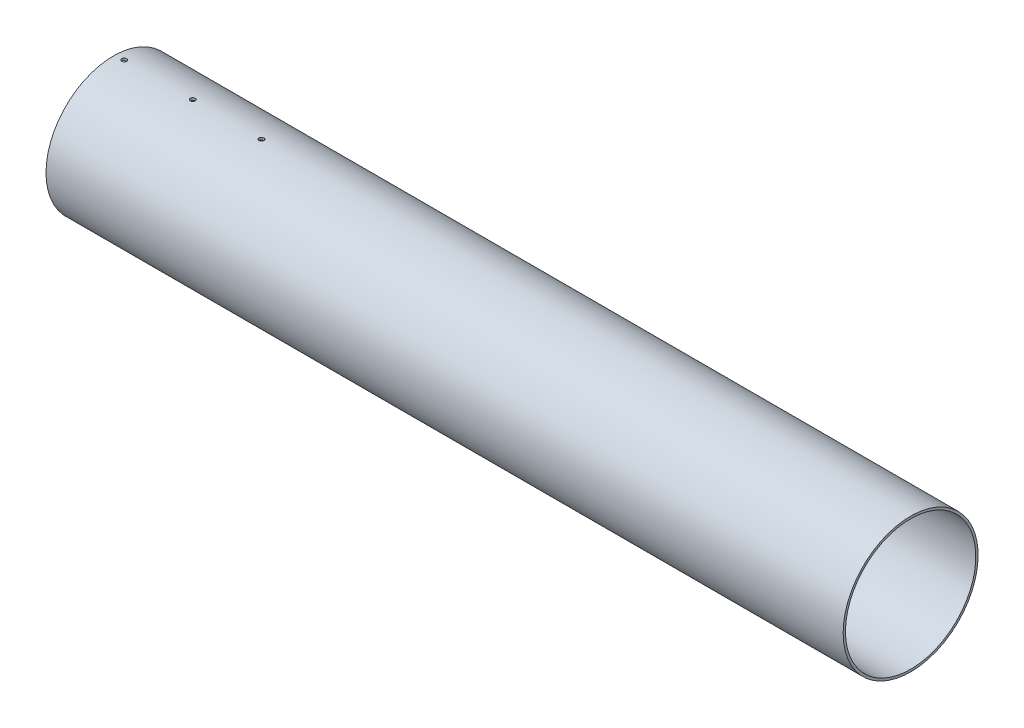
ISO-10303-21;
HEADER;
FILE_DESCRIPTION(('STEP AP214'),'2;1');
FILE_NAME('part.step','',(''),(''),'','','');
FILE_SCHEMA(('AUTOMOTIVE_DESIGN { 1 0 10303 214 1 1 1 1 }'));
ENDSEC;
DATA;
#1=APPLICATION_CONTEXT('core data for automotive mechanical design processes');
#2=APPLICATION_PROTOCOL_DEFINITION('international standard','automotive_design',2000,#1);
#3=PRODUCT_CONTEXT('',#1,'mechanical');
#4=PRODUCT('Part','Part','',(#3));
#5=PRODUCT_RELATED_PRODUCT_CATEGORY('part','',(#4));
#6=PRODUCT_DEFINITION_FORMATION('','',#4);
#7=PRODUCT_DEFINITION_CONTEXT('part definition',#1,'design');
#8=PRODUCT_DEFINITION('design','',#6,#7);
#9=PRODUCT_DEFINITION_SHAPE('','',#8);
#10=(LENGTH_UNIT() NAMED_UNIT(*) SI_UNIT(.MILLI.,.METRE.));
#11=(NAMED_UNIT(*) PLANE_ANGLE_UNIT() SI_UNIT($,.RADIAN.));
#12=(NAMED_UNIT(*) SI_UNIT($,.STERADIAN.) SOLID_ANGLE_UNIT());
#13=UNCERTAINTY_MEASURE_WITH_UNIT(LENGTH_MEASURE(1.E-05),#10,'distance_accuracy_value','');
#14=(GEOMETRIC_REPRESENTATION_CONTEXT(3) GLOBAL_UNCERTAINTY_ASSIGNED_CONTEXT((#13)) GLOBAL_UNIT_ASSIGNED_CONTEXT((#10,
#11,#12)) REPRESENTATION_CONTEXT('',''));
#15=CARTESIAN_POINT('',(0.,0.,0.));
#16=DIRECTION('',(0.,0.,1.));
#17=DIRECTION('',(1.,0.,0.));
#18=AXIS2_PLACEMENT_3D('',#15,#16,#17);
#19=CARTESIAN_POINT('',(0.,76.2,0.));
#20=DIRECTION('',(1.,0.,0.));
#21=DIRECTION('',(0.,0.,-1.));
#22=AXIS2_PLACEMENT_3D('',#19,#20,#21);
#23=PLANE('',#22);
#24=CARTESIAN_POINT('',(0.,0.,0.));
#25=DIRECTION('',(-1.,0.,0.));
#26=DIRECTION('',(0.,0.,1.));
#27=AXIS2_PLACEMENT_3D('',#24,#25,#26);
#28=CIRCLE('',#27,73.6092);
#29=CARTESIAN_POINT('',(0.,0.,73.6092));
#30=VERTEX_POINT('',#29);
#31=EDGE_CURVE('E45',#30,#30,#28,.T.);
#32=ORIENTED_EDGE('',*,*,#31,.F.);
#33=EDGE_LOOP('',(#32));
#34=FACE_BOUND('',#33,.T.);
#35=CARTESIAN_POINT('',(0.,0.,0.));
#36=DIRECTION('',(-1.,0.,0.));
#37=DIRECTION('',(0.,0.,1.));
#38=AXIS2_PLACEMENT_3D('',#35,#36,#37);
#39=CIRCLE('',#38,76.2);
#40=CARTESIAN_POINT('',(0.,0.,76.2));
#41=VERTEX_POINT('',#40);
#42=EDGE_CURVE('E77',#41,#41,#39,.T.);
#43=ORIENTED_EDGE('',*,*,#42,.T.);
#44=EDGE_LOOP('',(#43));
#45=FACE_BOUND('',#44,.T.);
#46=ADVANCED_FACE('F31',(#34,#45),#23,.F.);
#47=CARTESIAN_POINT('',(0.,0.,0.));
#48=DIRECTION('',(-1.,0.,0.));
#49=DIRECTION('',(0.,0.,1.));
#50=AXIS2_PLACEMENT_3D('',#47,#48,#49);
#51=CYLINDRICAL_SURFACE('',#50,73.6092);
#52=CARTESIAN_POINT('',(165.,73.6059837825038,0.688095959722686));
#53=CARTESIAN_POINT('',(165.15446929266,73.6059842831227,0.688089143597662));
#54=CARTESIAN_POINT('',(165.309049154193,73.6061094478616,0.67503746338891));
#55=CARTESIAN_POINT('',(165.613949849721,73.6065666337611,0.62315343551505));
#56=CARTESIAN_POINT('',(165.764265397929,73.6068989008431,0.584290434886237));
#57=CARTESIAN_POINT('',(166.056178474909,73.6076403171617,0.481890320900383));
#58=CARTESIAN_POINT('',(166.197780094308,73.6080494299529,0.418364888918095));
#59=CARTESIAN_POINT('',(166.468269830032,73.6087484289479,0.26845877703024));
#60=CARTESIAN_POINT('',(166.597161047605,73.6090383442899,0.18208369131227));
#61=CARTESIAN_POINT('',(166.838630024376,73.6092623489892,-0.0110879684674847));
#62=CARTESIAN_POINT('',(166.951205996039,73.6091963993874,-0.117886777229757));
#63=CARTESIAN_POINT('',(167.156833284504,73.6084636665608,-0.348871499237712));
#64=CARTESIAN_POINT('',(167.24988388687,73.6077968613553,-0.473058048425747));
#65=CARTESIAN_POINT('',(167.41379211394,73.6056443874573,-0.735252448345545));
#66=CARTESIAN_POINT('',(167.484655309991,73.604158924592,-0.873256817861151));
#67=CARTESIAN_POINT('',(167.602210457618,73.6002107900855,-1.15918886886157));
#68=CARTESIAN_POINT('',(167.648902525806,73.597748123159,-1.30711650246821));
#69=CARTESIAN_POINT('',(167.716788018404,73.5917746206579,-1.60864978023832));
#70=CARTESIAN_POINT('',(167.737988090478,73.5882640586459,-1.7622539333355));
#71=CARTESIAN_POINT('',(167.754322051861,73.5802274120274,-2.07081491635571));
#72=CARTESIAN_POINT('',(167.749455935889,73.5757013272152,-2.22577174655275));
#73=CARTESIAN_POINT('',(167.713802047991,73.5657752810624,-2.53271121606239));
#74=CARTESIAN_POINT('',(167.683003330484,73.5603749514999,-2.68469257177156));
#75=CARTESIAN_POINT('',(167.596355027046,73.5489506238271,-2.98131372327432));
#76=CARTESIAN_POINT('',(167.540505221373,73.5429266202464,-3.1259534546565));
#77=CARTESIAN_POINT('',(167.405266468792,73.5305840153582,-3.40395986420433));
#78=CARTESIAN_POINT('',(167.325851524547,73.5242650952176,-3.5373138819164));
#79=CARTESIAN_POINT('',(167.145753834864,73.5117352336343,-3.78879735569409));
#80=CARTESIAN_POINT('',(167.04507098776,73.5055242927078,-3.90692673897761));
#81=CARTESIAN_POINT('',(166.825219612942,73.4936276549916,-4.12467492278268));
#82=CARTESIAN_POINT('',(166.706040771465,73.4879422540937,-4.22428332707366));
#83=CARTESIAN_POINT('',(166.452610612723,73.4775071278569,-4.40207085909387));
#84=CARTESIAN_POINT('',(166.318359378464,73.4727573973655,-4.48025010482835));
#85=CARTESIAN_POINT('',(166.038739261076,73.4645503950928,-4.61287241836467));
#86=CARTESIAN_POINT('',(165.893382139721,73.4610917781911,-4.66734019936069));
#87=CARTESIAN_POINT('',(165.595558410428,73.4557228247752,-4.75109308399522));
#88=CARTESIAN_POINT('',(165.443091889933,73.4538124692233,-4.78037849728264));
#89=CARTESIAN_POINT('',(165.135682912205,73.451689328727,-4.81289206243856));
#90=CARTESIAN_POINT('',(164.980745620328,73.4514733747885,-4.81616885766713));
#91=CARTESIAN_POINT('',(164.672522704976,73.4527473620883,-4.79669899171546));
#92=CARTESIAN_POINT('',(164.519237072354,73.4542372938741,-4.77395247473265));
#93=CARTESIAN_POINT('',(164.218779258172,73.4588066165611,-4.70311603563841));
#94=CARTESIAN_POINT('',(164.071602812546,73.461884877983,-4.65504412219574));
#95=CARTESIAN_POINT('',(163.78741049707,73.4693964223735,-4.53494358324473));
#96=CARTESIAN_POINT('',(163.650394695652,73.4738297144674,-4.46291479640258));
#97=CARTESIAN_POINT('',(163.390224243495,73.4837283681259,-4.29684666762267));
#98=CARTESIAN_POINT('',(163.26708708459,73.4891950093501,-4.20277999987749));
#99=CARTESIAN_POINT('',(163.038339491366,73.5007635133932,-3.99535344990872));
#100=CARTESIAN_POINT('',(162.932729258677,73.5068653835183,-3.88199334576617));
#101=CARTESIAN_POINT('',(162.741834951625,73.5192973854577,-3.63896137665244));
#102=CARTESIAN_POINT('',(162.656588105437,73.5256279113493,-3.50926028825842));
#103=CARTESIAN_POINT('',(162.509080423696,73.5381003426952,-3.23737817754527));
#104=CARTESIAN_POINT('',(162.44681964998,73.5442422476419,-3.09519712165381));
#105=CARTESIAN_POINT('',(162.347026713028,73.5559849938833,-2.80229760393435));
#106=CARTESIAN_POINT('',(162.30950805696,73.5615855382181,-2.65157452753586));
#107=CARTESIAN_POINT('',(162.260331839056,73.5719665730914,-2.34593902118086));
#108=CARTESIAN_POINT('',(162.248674193611,73.576747066281,-2.19102660477008));
#109=CARTESIAN_POINT('',(162.251564361935,73.5853111259432,-1.88155577079569));
#110=CARTESIAN_POINT('',(162.266089002587,73.5890955705899,-1.72699716130362));
#111=CARTESIAN_POINT('',(162.320898305646,73.5956115305121,-1.4224939283462));
#112=CARTESIAN_POINT('',(162.361182873399,73.5983430496565,-1.27254928792908));
#113=CARTESIAN_POINT('',(162.466322933928,73.6027973111553,-0.981685619851943));
#114=CARTESIAN_POINT('',(162.531154705875,73.6045210233109,-0.84075803190006));
#115=CARTESIAN_POINT('',(162.683552514648,73.6071022558696,-0.57178226129702));
#116=CARTESIAN_POINT('',(162.771117654675,73.607959810435,-0.443733570867576));
#117=CARTESIAN_POINT('',(162.966471340188,73.6090144431281,-0.204178592926138));
#118=CARTESIAN_POINT('',(163.074254640249,73.6092116923167,-0.0926680281485954));
#119=CARTESIAN_POINT('',(163.307036199527,73.6091872018725,0.110712674729858));
#120=CARTESIAN_POINT('',(163.432038702315,73.608965358785,0.202577957079658));
#121=CARTESIAN_POINT('',(163.695777143936,73.6083440409598,0.364089228143964));
#122=CARTESIAN_POINT('',(163.834523885715,73.6079444256183,0.433717554162373));
#123=CARTESIAN_POINT('',(164.121629247267,73.6071781603076,0.548616752488847));
#124=CARTESIAN_POINT('',(164.269976258736,73.6068114717603,0.593916447543426));
#125=CARTESIAN_POINT('',(164.516042928568,73.6063597658129,0.64692766372909));
#126=CARTESIAN_POINT('',(164.612170646302,73.6062207270973,0.662346332875566));
#127=CARTESIAN_POINT('',(164.805517630183,73.6060325778304,0.682932627078205));
#128=CARTESIAN_POINT('',(164.90273689639,73.6059834672842,0.688100251562592));
#129=CARTESIAN_POINT('',(165.,73.6059837825038,0.688095959722686));
#130=B_SPLINE_CURVE_WITH_KNOTS('',3,(#52,#53,#54,#55,#56,#57,#58,#59,#60,#61,#62,#63,#64,#65,
#66,#67,#68,#69,#70,#71,#72,#73,#74,#75,#76,#77,#78,#79,#80,#81,#82,#83,#84,#85,#86,#87,#88,#89,
#90,#91,#92,#93,#94,#95,#96,#97,#98,#99,#100,#101,#102,#103,#104,#105,#106,#107,#108,#109,#110,
#111,#112,#113,#114,#115,#116,#117,#118,#119,#120,#121,#122,#123,#124,#125,#126,#127,#128,#129),
.UNSPECIFIED.,.T.,.F.,(4,2,2,2,2,2,2,2,2,2,2,2,2,2,2,2,2,2,2,2,2,2,2,2,2,2,2,2,2,2,2,2,2,2,2,2,
2,2,4),(0.,0.463053029383297,0.926656956135038,1.3900415639969,1.85331282811971,
2.31663481098125,2.77997374389316,3.24319623704508,3.70641649538275,4.16951593142185,
4.63261546126814,5.09591055328104,5.55920970929014,6.02302189471975,6.48683629734375,
6.95091026832061,7.41498168370198,7.87856825741837,8.34214913067303,8.8048627737912,
9.26757385298542,9.72995634559745,10.1923419521152,10.655303955462,11.1182712842982,
11.582078637094,12.0458872376151,12.5099488304784,12.9740089230346,13.4376584922475,
13.9013063578044,14.3645073228543,14.8276900180431,15.2907527103202,15.753929726478,
16.2174737319162,16.6804673467342,16.9720332074059,17.2635990843404),.UNSPECIFIED.);
#131=CARTESIAN_POINT('',(165.,73.6059837825038,0.688095959722686));
#132=VERTEX_POINT('',#131);
#133=EDGE_CURVE('E90',#132,#132,#130,.T.);
#134=ORIENTED_EDGE('',*,*,#133,.T.);
#135=EDGE_LOOP('',(#134));
#136=FACE_BOUND('',#135,.T.);
#137=CARTESIAN_POINT('',(87.5,73.6059837825038,0.688095959722676));
#138=CARTESIAN_POINT('',(87.6544692926599,73.6059842831227,0.688089143597653));
#139=CARTESIAN_POINT('',(87.8090491541929,73.6061094478616,0.675037463388901));
#140=CARTESIAN_POINT('',(88.1139498497208,73.6065666337611,0.623153435515038));
#141=CARTESIAN_POINT('',(88.2642653979287,73.6068989008431,0.584290434886223));
#142=CARTESIAN_POINT('',(88.5561784749091,73.6076403171617,0.481890320900373));
#143=CARTESIAN_POINT('',(88.6977800943081,73.6080494299529,0.418364888918091));
#144=CARTESIAN_POINT('',(88.9682698300324,73.6087484289479,0.268458777030234));
#145=CARTESIAN_POINT('',(89.0971610476049,73.6090383442899,0.182083691312253));
#146=CARTESIAN_POINT('',(89.3386300243757,73.6092623489892,-0.0110879684675091));
#147=CARTESIAN_POINT('',(89.4512059960388,73.6091963993874,-0.117886777229776));
#148=CARTESIAN_POINT('',(89.6568332845037,73.6084636665608,-0.348871499237724));
#149=CARTESIAN_POINT('',(89.7498838868699,73.6077968613553,-0.473058048425758));
#150=CARTESIAN_POINT('',(89.9137921139398,73.6056443874573,-0.735252448345561));
#151=CARTESIAN_POINT('',(89.9846553099907,73.604158924592,-0.873256817861171));
#152=CARTESIAN_POINT('',(90.1022104576177,73.6002107900855,-1.1591888688616));
#153=CARTESIAN_POINT('',(90.1489025258062,73.597748123159,-1.30711650246824));
#154=CARTESIAN_POINT('',(90.2167880184037,73.5917746206579,-1.60864978023834));
#155=CARTESIAN_POINT('',(90.237988090478,73.5882640586459,-1.76225393333552));
#156=CARTESIAN_POINT('',(90.2543220518608,73.5802274120274,-2.07081491635573));
#157=CARTESIAN_POINT('',(90.2494559358891,73.5757013272152,-2.22577174655276));
#158=CARTESIAN_POINT('',(90.2138020479912,73.5657752810624,-2.5327112160624));
#159=CARTESIAN_POINT('',(90.1830033304842,73.5603749514999,-2.68469257177157));
#160=CARTESIAN_POINT('',(90.0963550270464,73.5489506238271,-2.98131372327433));
#161=CARTESIAN_POINT('',(90.0405052213733,73.5429266202464,-3.12595345465651));
#162=CARTESIAN_POINT('',(89.9052664687915,73.5305840153582,-3.40395986420434));
#163=CARTESIAN_POINT('',(89.8258515245468,73.5242650952176,-3.53731388191641));
#164=CARTESIAN_POINT('',(89.645753834864,73.5117352336343,-3.7887973556941));
#165=CARTESIAN_POINT('',(89.5450709877596,73.5055242927078,-3.90692673897761));
#166=CARTESIAN_POINT('',(89.3252196129419,73.4936276549916,-4.12467492278268));
#167=CARTESIAN_POINT('',(89.2060407714651,73.4879422540937,-4.22428332707366));
#168=CARTESIAN_POINT('',(88.9526106127231,73.4775071278569,-4.40207085909387));
#169=CARTESIAN_POINT('',(88.8183593784637,73.4727573973655,-4.48025010482835));
#170=CARTESIAN_POINT('',(88.5387392610756,73.4645503950928,-4.61287241836466));
#171=CARTESIAN_POINT('',(88.3933821397211,73.4610917781911,-4.66734019936067));
#172=CARTESIAN_POINT('',(88.0955584104282,73.4557228247752,-4.7510930839952));
#173=CARTESIAN_POINT('',(87.9430918899332,73.4538124692233,-4.78037849728262));
#174=CARTESIAN_POINT('',(87.6356829122052,73.451689328727,-4.81289206243855));
#175=CARTESIAN_POINT('',(87.4807456203282,73.4514733747885,-4.81616885766712));
#176=CARTESIAN_POINT('',(87.1725227049764,73.4527473620883,-4.79669899171544));
#177=CARTESIAN_POINT('',(87.0192370723542,73.4542372938741,-4.77395247473263));
#178=CARTESIAN_POINT('',(86.7187792581719,73.4588066165611,-4.70311603563839));
#179=CARTESIAN_POINT('',(86.5716028125465,73.461884877983,-4.65504412219572));
#180=CARTESIAN_POINT('',(86.2874104970703,73.4693964223735,-4.53494358324472));
#181=CARTESIAN_POINT('',(86.1503946956524,73.4738297144674,-4.46291479640256));
#182=CARTESIAN_POINT('',(85.8902242434955,73.4837283681259,-4.29684666762265));
#183=CARTESIAN_POINT('',(85.7670870845898,73.4891950093501,-4.20277999987747));
#184=CARTESIAN_POINT('',(85.5383394913665,73.5007635133932,-3.9953534499087));
#185=CARTESIAN_POINT('',(85.4327292586765,73.5068653835183,-3.88199334576614));
#186=CARTESIAN_POINT('',(85.2418349516253,73.5192973854577,-3.63896137665241));
#187=CARTESIAN_POINT('',(85.156588105437,73.5256279113493,-3.50926028825839));
#188=CARTESIAN_POINT('',(85.009080423696,73.5381003426952,-3.23737817754524));
#189=CARTESIAN_POINT('',(84.9468196499804,73.5442422476419,-3.09519712165378));
#190=CARTESIAN_POINT('',(84.8470267130279,73.5559849938833,-2.80229760393432));
#191=CARTESIAN_POINT('',(84.8095080569598,73.5615855382181,-2.65157452753583));
#192=CARTESIAN_POINT('',(84.7603318390556,73.5719665730914,-2.34593902118084));
#193=CARTESIAN_POINT('',(84.7486741936111,73.576747066281,-2.19102660477006));
#194=CARTESIAN_POINT('',(84.7515643619355,73.5853111259432,-1.88155577079568));
#195=CARTESIAN_POINT('',(84.7660890025868,73.5890955705899,-1.7269971613036));
#196=CARTESIAN_POINT('',(84.8208983056457,73.5956115305121,-1.42249392834618));
#197=CARTESIAN_POINT('',(84.8611828733993,73.5983430496565,-1.27254928792906));
#198=CARTESIAN_POINT('',(84.9663229339285,73.6027973111553,-0.981685619851929));
#199=CARTESIAN_POINT('',(85.0311547058751,73.6045210233109,-0.840758031900052));
#200=CARTESIAN_POINT('',(85.1835525146484,73.6071022558696,-0.571782261297015));
#201=CARTESIAN_POINT('',(85.2711176546754,73.607959810435,-0.443733570867567));
#202=CARTESIAN_POINT('',(85.466471340188,73.6090144431281,-0.204178592926119));
#203=CARTESIAN_POINT('',(85.5742546402488,73.6092116923167,-0.0926680281485712));
#204=CARTESIAN_POINT('',(85.8070361995274,73.6091872018725,0.110712674729876));
#205=CARTESIAN_POINT('',(85.9320387023147,73.608965358785,0.202577957079665));
#206=CARTESIAN_POINT('',(86.1957771439358,73.6083440409598,0.364089228143968));
#207=CARTESIAN_POINT('',(86.3345238857149,73.6079444256183,0.433717554162385));
#208=CARTESIAN_POINT('',(86.621629247267,73.6071781603076,0.548616752488854));
#209=CARTESIAN_POINT('',(86.7699762587363,73.6068114717603,0.593916447543425));
#210=CARTESIAN_POINT('',(87.016042928568,73.6063597658129,0.646927663729081));
#211=CARTESIAN_POINT('',(87.1121706463022,73.6062207270973,0.662346332875556));
#212=CARTESIAN_POINT('',(87.3055176301827,73.6060325778304,0.682932627078193));
#213=CARTESIAN_POINT('',(87.40273689639,73.6059834672842,0.688100251562581));
#214=CARTESIAN_POINT('',(87.5,73.6059837825038,0.688095959722676));
#215=B_SPLINE_CURVE_WITH_KNOTS('',3,(#137,#138,#139,#140,#141,#142,#143,#144,#145,#146,#147,
#148,#149,#150,#151,#152,#153,#154,#155,#156,#157,#158,#159,#160,#161,#162,#163,#164,#165,#166,
#167,#168,#169,#170,#171,#172,#173,#174,#175,#176,#177,#178,#179,#180,#181,#182,#183,#184,#185,
#186,#187,#188,#189,#190,#191,#192,#193,#194,#195,#196,#197,#198,#199,#200,#201,#202,#203,#204,
#205,#206,#207,#208,#209,#210,#211,#212,#213,#214),.UNSPECIFIED.,.T.,.F.,(4,2,2,2,2,2,2,2,2,2,2,
2,2,2,2,2,2,2,2,2,2,2,2,2,2,2,2,2,2,2,2,2,2,2,2,2,2,2,4),(0.,0.463053029383311,
0.926656956135039,1.39004156399689,1.85331282811972,2.31663481098124,2.77997374389316,
3.24319623704509,3.70641649538275,4.16951593142185,4.63261546126813,5.09591055328103,
5.55920970929013,6.02302189471974,6.48683629734375,6.9509102683206,7.41498168370195,
7.87856825741833,8.34214913067298,8.80486277379118,9.26757385298543,9.7299563455974,
10.1923419521151,10.6553039554619,11.1182712842981,11.582078637094,12.0458872376151,
12.5099488304783,12.9740089230345,13.4376584922474,13.9013063578044,14.3645073228543,
14.827690018043,15.2907527103202,15.7539297264779,16.2174737319161,16.6804673467341,
16.9720332074058,17.2635990843403),.UNSPECIFIED.);
#216=CARTESIAN_POINT('',(87.5,73.6059837825038,0.688095959722676));
#217=VERTEX_POINT('',#216);
#218=EDGE_CURVE('E56',#217,#217,#215,.T.);
#219=ORIENTED_EDGE('',*,*,#218,.T.);
#220=EDGE_LOOP('',(#219));
#221=FACE_BOUND('',#220,.T.);
#222=CARTESIAN_POINT('',(10.,73.6059837825038,0.68809595972268));
#223=CARTESIAN_POINT('',(10.1544692926599,73.6059842831227,0.688089143597657));
#224=CARTESIAN_POINT('',(10.3090491541929,73.6061094478616,0.675037463388905));
#225=CARTESIAN_POINT('',(10.6139498497209,73.6065666337611,0.623153435515044));
#226=CARTESIAN_POINT('',(10.7642653979287,73.6068989008431,0.584290434886228));
#227=CARTESIAN_POINT('',(11.0561784749091,73.6076403171617,0.481890320900376));
#228=CARTESIAN_POINT('',(11.1977800943081,73.6080494299529,0.418364888918092));
#229=CARTESIAN_POINT('',(11.4682698300324,73.6087484289479,0.268458777030233));
#230=CARTESIAN_POINT('',(11.5971610476049,73.6090383442899,0.182083691312255));
#231=CARTESIAN_POINT('',(11.8386300243757,73.6092623489892,-0.0110879684675035));
#232=CARTESIAN_POINT('',(11.9512059960388,73.6091963993874,-0.11788677722977));
#233=CARTESIAN_POINT('',(12.1568332845037,73.6084636665608,-0.348871499237718));
#234=CARTESIAN_POINT('',(12.24988388687,73.6077968613553,-0.473058048425751));
#235=CARTESIAN_POINT('',(12.4137921139398,73.6056443874573,-0.735252448345552));
#236=CARTESIAN_POINT('',(12.4846553099907,73.604158924592,-0.873256817861162));
#237=CARTESIAN_POINT('',(12.6022104576178,73.6002107900855,-1.15918886886159));
#238=CARTESIAN_POINT('',(12.6489025258063,73.597748123159,-1.30711650246823));
#239=CARTESIAN_POINT('',(12.7167880184037,73.5917746206579,-1.60864978023833));
#240=CARTESIAN_POINT('',(12.737988090478,73.5882640586459,-1.76225393333551));
#241=CARTESIAN_POINT('',(12.7543220518608,73.5802274120274,-2.07081491635572));
#242=CARTESIAN_POINT('',(12.7494559358891,73.5757013272152,-2.22577174655275));
#243=CARTESIAN_POINT('',(12.7138020479913,73.5657752810624,-2.53271121606239));
#244=CARTESIAN_POINT('',(12.6830033304843,73.5603749514999,-2.68469257177156));
#245=CARTESIAN_POINT('',(12.5963550270464,73.5489506238271,-2.98131372327432));
#246=CARTESIAN_POINT('',(12.5405052213733,73.5429266202464,-3.1259534546565));
#247=CARTESIAN_POINT('',(12.4052664687915,73.5305840153582,-3.40395986420433));
#248=CARTESIAN_POINT('',(12.3258515245469,73.5242650952176,-3.5373138819164));
#249=CARTESIAN_POINT('',(12.145753834864,73.5117352336343,-3.78879735569409));
#250=CARTESIAN_POINT('',(12.0450709877596,73.5055242927078,-3.9069267389776));
#251=CARTESIAN_POINT('',(11.8252196129419,73.4936276549916,-4.12467492278267));
#252=CARTESIAN_POINT('',(11.7060407714652,73.4879422540937,-4.22428332707366));
#253=CARTESIAN_POINT('',(11.4526106127232,73.4775071278569,-4.40207085909387));
#254=CARTESIAN_POINT('',(11.3183593784637,73.4727573973655,-4.48025010482835));
#255=CARTESIAN_POINT('',(11.0387392610756,73.4645503950928,-4.61287241836467));
#256=CARTESIAN_POINT('',(10.8933821397211,73.4610917781911,-4.66734019936068));
#257=CARTESIAN_POINT('',(10.5955584104283,73.4557228247752,-4.7510930839952));
#258=CARTESIAN_POINT('',(10.4430918899332,73.4538124692233,-4.78037849728262));
#259=CARTESIAN_POINT('',(10.1356829122052,73.451689328727,-4.81289206243855));
#260=CARTESIAN_POINT('',(9.98074562032829,73.4514733747885,-4.81616885766712));
#261=CARTESIAN_POINT('',(9.67252270497641,73.4527473620883,-4.79669899171545));
#262=CARTESIAN_POINT('',(9.5192370723542,73.4542372938741,-4.77395247473263));
#263=CARTESIAN_POINT('',(9.21877925817193,73.4588066165611,-4.70311603563839));
#264=CARTESIAN_POINT('',(9.07160281254651,73.461884877983,-4.65504412219572));
#265=CARTESIAN_POINT('',(8.7874104970703,73.4693964223735,-4.53494358324472));
#266=CARTESIAN_POINT('',(8.65039469565237,73.4738297144674,-4.46291479640256));
#267=CARTESIAN_POINT('',(8.39022424349552,73.4837283681259,-4.29684666762265));
#268=CARTESIAN_POINT('',(8.26708708458978,73.4891950093501,-4.20277999987747));
#269=CARTESIAN_POINT('',(8.03833949136648,73.5007635133932,-3.9953534499087));
#270=CARTESIAN_POINT('',(7.93272925867655,73.5068653835183,-3.88199334576615));
#271=CARTESIAN_POINT('',(7.74183495162532,73.5192973854577,-3.63896137665242));
#272=CARTESIAN_POINT('',(7.65658810543701,73.5256279113493,-3.5092602882584));
#273=CARTESIAN_POINT('',(7.50908042369598,73.5381003426952,-3.23737817754525));
#274=CARTESIAN_POINT('',(7.44681964998038,73.5442422476419,-3.09519712165379));
#275=CARTESIAN_POINT('',(7.34702671302795,73.5559849938833,-2.80229760393433));
#276=CARTESIAN_POINT('',(7.30950805695982,73.5615855382181,-2.65157452753584));
#277=CARTESIAN_POINT('',(7.26033183905556,73.5719665730914,-2.34593902118085));
#278=CARTESIAN_POINT('',(7.24867419361114,73.576747066281,-2.19102660477006));
#279=CARTESIAN_POINT('',(7.25156436193555,73.5853111259432,-1.88155577079568));
#280=CARTESIAN_POINT('',(7.26608900258677,73.5890955705899,-1.72699716130361));
#281=CARTESIAN_POINT('',(7.32089830564567,73.5956115305121,-1.42249392834618));
#282=CARTESIAN_POINT('',(7.36118287339932,73.5983430496565,-1.27254928792906));
#283=CARTESIAN_POINT('',(7.46632293392853,73.6027973111553,-0.981685619851933));
#284=CARTESIAN_POINT('',(7.53115470587506,73.6045210233109,-0.840758031900056));
#285=CARTESIAN_POINT('',(7.68355251464844,73.6071022558696,-0.571782261297019));
#286=CARTESIAN_POINT('',(7.77111765467539,73.607959810435,-0.44373357086757));
#287=CARTESIAN_POINT('',(7.966471340188,73.6090144431281,-0.204178592926121));
#288=CARTESIAN_POINT('',(8.07425464024884,73.6092116923167,-0.0926680281485738));
#289=CARTESIAN_POINT('',(8.30703619952743,73.6091872018725,0.110712674729874));
#290=CARTESIAN_POINT('',(8.43203870231475,73.608965358785,0.202577957079666));
#291=CARTESIAN_POINT('',(8.69577714393581,73.6083440409598,0.364089228143969));
#292=CARTESIAN_POINT('',(8.83452388571487,73.6079444256183,0.433717554162384));
#293=CARTESIAN_POINT('',(9.12162924726701,73.6071781603076,0.548616752488853));
#294=CARTESIAN_POINT('',(9.2699762587363,73.6068114717603,0.593916447543426));
#295=CARTESIAN_POINT('',(9.51604292856801,73.6063597658129,0.646927663729085));
#296=CARTESIAN_POINT('',(9.61217064630219,73.6062207270973,0.66234633287556));
#297=CARTESIAN_POINT('',(9.80551763018276,73.6060325778304,0.682932627078198));
#298=CARTESIAN_POINT('',(9.90273689639002,73.6059834672842,0.688100251562585));
#299=CARTESIAN_POINT('',(10.,73.6059837825038,0.68809595972268));
#300=B_SPLINE_CURVE_WITH_KNOTS('',3,(#222,#223,#224,#225,#226,#227,#228,#229,#230,#231,#232,
#233,#234,#235,#236,#237,#238,#239,#240,#241,#242,#243,#244,#245,#246,#247,#248,#249,#250,#251,
#252,#253,#254,#255,#256,#257,#258,#259,#260,#261,#262,#263,#264,#265,#266,#267,#268,#269,#270,
#271,#272,#273,#274,#275,#276,#277,#278,#279,#280,#281,#282,#283,#284,#285,#286,#287,#288,#289,
#290,#291,#292,#293,#294,#295,#296,#297,#298,#299),.UNSPECIFIED.,.T.,.F.,(4,2,2,2,2,2,2,2,2,2,2,
2,2,2,2,2,2,2,2,2,2,2,2,2,2,2,2,2,2,2,2,2,2,2,2,2,2,2,4),(0.,0.463053029383304,
0.926656956135039,1.39004156399691,1.85331282811972,2.31663481098124,2.77997374389316,
3.24319623704509,3.70641649538275,4.16951593142184,4.63261546126813,5.09591055328103,
5.55920970929013,6.02302189471973,6.48683629734374,6.9509102683206,7.41498168370196,
7.87856825741834,8.34214913067297,8.80486277379116,9.26757385298542,9.7299563455974,
10.1923419521151,10.6553039554619,11.1182712842981,11.582078637094,12.0458872376151,
12.5099488304783,12.9740089230345,13.4376584922475,13.9013063578044,14.3645073228543,
14.827690018043,15.2907527103202,15.7539297264779,16.2174737319161,16.6804673467341,
16.9720332074058,17.2635990843403),.UNSPECIFIED.);
#301=CARTESIAN_POINT('',(10.,73.6059837825038,0.68809595972268));
#302=VERTEX_POINT('',#301);
#303=EDGE_CURVE('E71',#302,#302,#300,.T.);
#304=ORIENTED_EDGE('',*,*,#303,.T.);
#305=EDGE_LOOP('',(#304));
#306=FACE_BOUND('',#305,.T.);
#307=CARTESIAN_POINT('',(900.,0.,0.));
#308=DIRECTION('',(-1.,0.,0.));
#309=DIRECTION('',(0.,0.,1.));
#310=AXIS2_PLACEMENT_3D('',#307,#308,#309);
#311=CIRCLE('',#310,73.6092);
#312=CARTESIAN_POINT('',(900.,0.,73.6092));
#313=VERTEX_POINT('',#312);
#314=EDGE_CURVE('E50',#313,#313,#311,.T.);
#315=ORIENTED_EDGE('',*,*,#314,.F.);
#316=EDGE_LOOP('',(#315));
#317=FACE_BOUND('',#316,.T.);
#318=ORIENTED_EDGE('',*,*,#31,.T.);
#319=EDGE_LOOP('',(#318));
#320=FACE_BOUND('',#319,.T.);
#321=ADVANCED_FACE('F83',(#136,#221,#306,#317,#320),#51,.F.);
#322=CARTESIAN_POINT('',(900.,76.2,0.));
#323=DIRECTION('',(-1.,0.,0.));
#324=DIRECTION('',(0.,0.,1.));
#325=AXIS2_PLACEMENT_3D('',#322,#323,#324);
#326=PLANE('',#325);
#327=CARTESIAN_POINT('',(900.,0.,0.));
#328=DIRECTION('',(-1.,0.,0.));
#329=DIRECTION('',(0.,0.,1.));
#330=AXIS2_PLACEMENT_3D('',#327,#328,#329);
#331=CIRCLE('',#330,76.2);
#332=CARTESIAN_POINT('',(900.,0.,76.2));
#333=VERTEX_POINT('',#332);
#334=EDGE_CURVE('E113',#333,#333,#331,.T.);
#335=ORIENTED_EDGE('',*,*,#334,.F.);
#336=EDGE_LOOP('',(#335));
#337=FACE_BOUND('',#336,.T.);
#338=ORIENTED_EDGE('',*,*,#314,.T.);
#339=EDGE_LOOP('',(#338));
#340=FACE_BOUND('',#339,.T.);
#341=ADVANCED_FACE('F86',(#337,#340),#326,.F.);
#342=CARTESIAN_POINT('',(0.,0.,0.));
#343=DIRECTION('',(-1.,0.,0.));
#344=DIRECTION('',(0.,0.,1.));
#345=AXIS2_PLACEMENT_3D('',#342,#343,#344);
#346=CYLINDRICAL_SURFACE('',#345,76.2);
#347=CARTESIAN_POINT('',(165.,76.1968931384359,0.688095959722686));
#348=CARTESIAN_POINT('',(164.845530746455,76.1968936221831,0.688089141305528));
#349=CARTESIAN_POINT('',(164.690950828129,76.1970145308535,0.675037460910197));
#350=CARTESIAN_POINT('',(164.386049899053,76.1974561715695,0.623153392230864));
#351=CARTESIAN_POINT('',(164.235734178487,76.1977771413712,0.5842903256631));
#352=CARTESIAN_POINT('',(163.943820799152,76.1984933493113,0.481890026917812));
#353=CARTESIAN_POINT('',(163.802219047321,76.1988885522226,0.418364483097205));
#354=CARTESIAN_POINT('',(163.531729139987,76.199563784755,0.26845813632701));
#355=CARTESIAN_POINT('',(163.40283787993,76.1998438425536,0.182082933512156));
#356=CARTESIAN_POINT('',(163.161368907063,76.200060229078,-0.0110889234638583));
#357=CARTESIAN_POINT('',(163.04879297651,76.1999965202804,-0.117887805719463));
#358=CARTESIAN_POINT('',(162.843165718595,76.199288696581,-0.348872744746742));
#359=CARTESIAN_POINT('',(162.750115109166,76.198644560342,-0.4730594405764));
#360=CARTESIAN_POINT('',(162.586205475317,76.1965652480913,-0.735256518453822));
#361=CARTESIAN_POINT('',(162.515341224227,76.1951302586092,-0.873263634555039));
#362=CARTESIAN_POINT('',(162.397784688167,76.1913162590314,-1.15920228919087));
#363=CARTESIAN_POINT('',(162.351092291113,76.1889372533131,-1.30713378170294));
#364=CARTESIAN_POINT('',(162.283206720671,76.1831666124126,-1.60867889057361));
#365=CARTESIAN_POINT('',(162.262007346564,76.1797752237248,-1.76229111582285));
#366=CARTESIAN_POINT('',(162.245677640897,76.1720113682666,-2.0708697506662));
#367=CARTESIAN_POINT('',(162.250547311143,76.1676389014282,-2.22583616035413));
#368=CARTESIAN_POINT('',(162.286211488431,76.1580498878114,-2.53279125651607));
#369=CARTESIAN_POINT('',(162.31701621294,76.1528330090198,-2.68477874525191));
#370=CARTESIAN_POINT('',(162.403679314511,76.1417968452037,-2.98141200057324));
#371=CARTESIAN_POINT('',(162.45953789849,76.1359775552043,-3.12605770651275));
#372=CARTESIAN_POINT('',(162.594791831843,76.1240549866134,-3.40406407117795));
#373=CARTESIAN_POINT('',(162.67421144249,76.1179514207853,-3.53741291443937));
#374=CARTESIAN_POINT('',(162.854317085642,76.1058488040809,-3.78888527168575));
#375=CARTESIAN_POINT('',(162.955003212338,76.0998497536678,-3.90700871823256));
#376=CARTESIAN_POINT('',(163.174854563329,76.0883594293166,-4.12473989023269));
#377=CARTESIAN_POINT('',(163.294029404832,76.0828684220321,-4.22433791975994));
#378=CARTESIAN_POINT('',(163.54744711764,76.0727902484079,-4.4021059934945));
#379=CARTESIAN_POINT('',(163.681689911648,76.0682030774319,-4.48027614761802));
#380=CARTESIAN_POINT('',(163.961298530798,76.0602767400065,-4.61288767996205));
#381=CARTESIAN_POINT('',(164.106653381982,76.0569363609623,-4.66735212230442));
#382=CARTESIAN_POINT('',(164.404470143834,76.051751014556,-4.75109917990703));
#383=CARTESIAN_POINT('',(164.55693197296,76.0499060300411,-4.7803820840121));
#384=CARTESIAN_POINT('',(164.864349753035,76.0478554433078,-4.81289445620412));
#385=CARTESIAN_POINT('',(165.019300886324,76.0476469853554,-4.81616930838279));
#386=CARTESIAN_POINT('',(165.327551141263,76.0488780174745,-4.79669093725112));
#387=CARTESIAN_POINT('',(165.480850271449,76.0503174990272,-4.77393784848883));
#388=CARTESIAN_POINT('',(165.781341766753,76.0547320673731,-4.70308153638329));
#389=CARTESIAN_POINT('',(165.928538109895,76.0577061363064,-4.65499511566726));
#390=CARTESIAN_POINT('',(166.21276757257,76.0649634562235,-4.53485777067538));
#391=CARTESIAN_POINT('',(166.349800628285,76.0692467154271,-4.46280669593569));
#392=CARTESIAN_POINT('',(166.609989844636,76.0788099864421,-4.29669339214783));
#393=CARTESIAN_POINT('',(166.73312967818,76.084091151886,-4.20260565709495));
#394=CARTESIAN_POINT('',(166.961878152896,76.0952670649024,-3.99513383283569));
#395=CARTESIAN_POINT('',(167.06748660536,76.1011618190785,-3.88174953594767));
#396=CARTESIAN_POINT('',(167.258359628704,76.1131709543072,-3.63868251943729));
#397=CARTESIAN_POINT('',(167.343589456485,76.119285690275,-3.50897253295032));
#398=CARTESIAN_POINT('',(167.49106191162,76.1313327853749,-3.2370762209384));
#399=CARTESIAN_POINT('',(167.553304482975,76.1372651440628,-3.09488986502083));
#400=CARTESIAN_POINT('',(167.653058657938,76.1486068538993,-2.80198980201636));
#401=CARTESIAN_POINT('',(167.69055766727,76.1540159375116,-2.65127179469678));
#402=CARTESIAN_POINT('',(167.739697353445,76.1640419422271,-2.34565163333239));
#403=CARTESIAN_POINT('',(167.751338105166,76.168658865624,-2.19074949140497));
#404=CARTESIAN_POINT('',(167.748418297407,76.1769300378877,-1.88129442501246));
#405=CARTESIAN_POINT('',(167.733879366255,76.1805850785543,-1.7267413178012));
#406=CARTESIAN_POINT('',(167.679043815626,76.1868781057697,-1.42225261274485));
#407=CARTESIAN_POINT('',(167.638747280972,76.1895160956678,-1.27231699969537));
#408=CARTESIAN_POINT('',(167.533582858671,76.1938178709476,-0.981464090345173));
#409=CARTESIAN_POINT('',(167.468737070018,76.1954825290937,-0.840538815999347));
#410=CARTESIAN_POINT('',(167.316311618573,76.1979751608489,-0.57157071053315));
#411=CARTESIAN_POINT('',(167.228732852261,76.1988031674453,-0.44352737168726));
#412=CARTESIAN_POINT('',(167.033351691448,76.1998212632395,-0.203984498379876));
#413=CARTESIAN_POINT('',(166.92555432912,76.2000115109464,-0.0924808597196828));
#414=CARTESIAN_POINT('',(166.692745496958,76.1999873780803,0.110883103155753));
#415=CARTESIAN_POINT('',(166.567729781857,76.1997728975537,0.202738568717062));
#416=CARTESIAN_POINT('',(166.303969146134,76.1991724778917,0.364225706928405));
#417=CARTESIAN_POINT('',(166.16521371027,76.1987864066345,0.433840183263286));
#418=CARTESIAN_POINT('',(165.878093441236,76.1980462212587,0.548710123428682));
#419=CARTESIAN_POINT('',(165.729740223797,76.1976920697075,0.593994437094018));
#420=CARTESIAN_POINT('',(165.483714629241,76.197255979056,0.646969202561486));
#421=CARTESIAN_POINT('',(165.387634402575,76.1971217989048,0.662372325974195));
#422=CARTESIAN_POINT('',(165.194384061015,76.1969402263713,0.682937850378788));
#423=CARTESIAN_POINT('',(165.097213946063,76.1968928339935,0.688100250837084));
#424=CARTESIAN_POINT('',(165.,76.1968931384359,0.688095959722686));
#425=B_SPLINE_CURVE_WITH_KNOTS('',3,(#347,#348,#349,#350,#351,#352,#353,#354,#355,#356,#357,
#358,#359,#360,#361,#362,#363,#364,#365,#366,#367,#368,#369,#370,#371,#372,#373,#374,#375,#376,
#377,#378,#379,#380,#381,#382,#383,#384,#385,#386,#387,#388,#389,#390,#391,#392,#393,#394,#395,
#396,#397,#398,#399,#400,#401,#402,#403,#404,#405,#406,#407,#408,#409,#410,#411,#412,#413,#414,
#415,#416,#417,#418,#419,#420,#421,#422,#423,#424),.UNSPECIFIED.,.T.,.F.,(4,2,2,2,2,2,2,2,2,2,2,
2,2,2,2,2,2,2,2,2,2,2,2,2,2,2,2,2,2,2,2,2,2,2,2,2,2,2,4),(0.,0.463053080634853,
0.926657513161992,1.39004249603652,1.85331401472287,2.31663610226751,2.77997522285884,
3.24320510756559,3.70643284427419,4.16954788638214,4.63266296057734,5.09596057066325,
5.55926200714392,6.02304218041675,6.4868244078493,6.95084869309993,7.41487059805181,
7.87844002504453,8.34200413459325,8.80475914590881,9.26751176508355,9.72995784389399,
10.1924068262607,10.6553937317729,11.1183856205543,11.5821613145302,12.0459381383015,
12.5099508390644,12.9739621961761,13.4375903864468,13.9012170499299,14.3644273498904,
14.827619385833,15.290696291284,15.7538875756149,16.2174361288796,16.6804338029498,
16.9718524110324,17.2632710342993),.UNSPECIFIED.);
#426=CARTESIAN_POINT('',(165.,76.1968931384359,0.688095959722686));
#427=VERTEX_POINT('',#426);
#428=EDGE_CURVE('E10',#427,#427,#425,.T.);
#429=ORIENTED_EDGE('',*,*,#428,.T.);
#430=EDGE_LOOP('',(#429));
#431=FACE_BOUND('',#430,.T.);
#432=CARTESIAN_POINT('',(87.5,76.1968931384359,0.688095959722676));
#433=CARTESIAN_POINT('',(87.3455307464553,76.1968936221831,0.688089141305517));
#434=CARTESIAN_POINT('',(87.1909508281295,76.1970145308535,0.675037460910189));
#435=CARTESIAN_POINT('',(86.8860498990527,76.1974561715695,0.623153392230857));
#436=CARTESIAN_POINT('',(86.7357341784871,76.1977771413712,0.58429032566309));
#437=CARTESIAN_POINT('',(86.4438207991517,76.1984933493113,0.481890026917792));
#438=CARTESIAN_POINT('',(86.3022190473208,76.1988885522226,0.418364483097181));
#439=CARTESIAN_POINT('',(86.0317291399871,76.199563784755,0.268458136326982));
#440=CARTESIAN_POINT('',(85.9028378799299,76.1998438425536,0.182082933512129));
#441=CARTESIAN_POINT('',(85.6613689070626,76.200060229078,-0.011088923463884));
#442=CARTESIAN_POINT('',(85.5487929765095,76.1999965202804,-0.117887805719489));
#443=CARTESIAN_POINT('',(85.3431657185948,76.199288696581,-0.34887274474677));
#444=CARTESIAN_POINT('',(85.2501151091656,76.198644560342,-0.473059440576431));
#445=CARTESIAN_POINT('',(85.0862054753172,76.1965652480913,-0.735256518453857));
#446=CARTESIAN_POINT('',(85.0153412242272,76.1951302586092,-0.873263634555075));
#447=CARTESIAN_POINT('',(84.897784688167,76.1913162590314,-1.1592022891909));
#448=CARTESIAN_POINT('',(84.8510922911129,76.1889372533131,-1.30713378170297));
#449=CARTESIAN_POINT('',(84.7832067206706,76.1831666124126,-1.60867889057364));
#450=CARTESIAN_POINT('',(84.7620073465641,76.1797752237248,-1.76229111582288));
#451=CARTESIAN_POINT('',(84.7456776408973,76.1720113682666,-2.07086975066623));
#452=CARTESIAN_POINT('',(84.7505473111431,76.1676389014282,-2.22583616035416));
#453=CARTESIAN_POINT('',(84.786211488431,76.1580498878114,-2.53279125651609));
#454=CARTESIAN_POINT('',(84.8170162129397,76.1528330090198,-2.68477874525194));
#455=CARTESIAN_POINT('',(84.9036793145108,76.1417968452037,-2.98141200057326));
#456=CARTESIAN_POINT('',(84.9595378984902,76.1359775552043,-3.12605770651278));
#457=CARTESIAN_POINT('',(85.094791831843,76.1240549866134,-3.40406407117797));
#458=CARTESIAN_POINT('',(85.1742114424903,76.1179514207853,-3.53741291443939));
#459=CARTESIAN_POINT('',(85.3543170856422,76.1058488040809,-3.78888527168576));
#460=CARTESIAN_POINT('',(85.4550032123377,76.0998497536678,-3.90700871823257));
#461=CARTESIAN_POINT('',(85.674854563329,76.0883594293166,-4.1247398902327));
#462=CARTESIAN_POINT('',(85.7940294048322,76.0828684220321,-4.22433791975994));
#463=CARTESIAN_POINT('',(86.0474471176405,76.0727902484079,-4.40210599349449));
#464=CARTESIAN_POINT('',(86.1816899116482,76.0682030774319,-4.48027614761801));
#465=CARTESIAN_POINT('',(86.4612985307983,76.0602767400065,-4.61288767996203));
#466=CARTESIAN_POINT('',(86.6066533819821,76.0569363609623,-4.66735212230442));
#467=CARTESIAN_POINT('',(86.9044701438339,76.051751014556,-4.75109917990703));
#468=CARTESIAN_POINT('',(87.0569319729604,76.0499060300411,-4.78038208401209));
#469=CARTESIAN_POINT('',(87.3643497530355,76.0478554433078,-4.8128944562041));
#470=CARTESIAN_POINT('',(87.5193008863239,76.0476469853554,-4.81616930838277));
#471=CARTESIAN_POINT('',(87.8275511412626,76.0488780174745,-4.7966909372511));
#472=CARTESIAN_POINT('',(87.9808502714487,76.0503174990272,-4.7739378484888));
#473=CARTESIAN_POINT('',(88.2813417667528,76.0547320673731,-4.70308153638326));
#474=CARTESIAN_POINT('',(88.4285381098946,76.0577061363064,-4.65499511566724));
#475=CARTESIAN_POINT('',(88.7127675725697,76.0649634562235,-4.53485777067535));
#476=CARTESIAN_POINT('',(88.8498006282855,76.0692467154271,-4.46280669593566));
#477=CARTESIAN_POINT('',(89.1099898446362,76.0788099864421,-4.2966933921478));
#478=CARTESIAN_POINT('',(89.2331296781801,76.084091151886,-4.20260565709492));
#479=CARTESIAN_POINT('',(89.4618781528958,76.0952670649025,-3.99513383283566));
#480=CARTESIAN_POINT('',(89.5674866053598,76.1011618190785,-3.88174953594763));
#481=CARTESIAN_POINT('',(89.7583596287042,76.1131709543072,-3.63868251943726));
#482=CARTESIAN_POINT('',(89.8435894564847,76.119285690275,-3.50897253295029));
#483=CARTESIAN_POINT('',(89.9910619116197,76.1313327853749,-3.23707622093837));
#484=CARTESIAN_POINT('',(90.053304482975,76.1372651440628,-3.0948898650208));
#485=CARTESIAN_POINT('',(90.1530586579383,76.1486068538993,-2.80198980201633));
#486=CARTESIAN_POINT('',(90.1905576672703,76.1540159375116,-2.65127179469675));
#487=CARTESIAN_POINT('',(90.2396973534452,76.1640419422271,-2.34565163333236));
#488=CARTESIAN_POINT('',(90.2513381051664,76.168658865624,-2.19074949140494));
#489=CARTESIAN_POINT('',(90.2484182974066,76.1769300378878,-1.88129442501243));
#490=CARTESIAN_POINT('',(90.233879366255,76.1805850785544,-1.72674131780118));
#491=CARTESIAN_POINT('',(90.1790438156261,76.1868781057697,-1.42225261274482));
#492=CARTESIAN_POINT('',(90.1387472809723,76.1895160956678,-1.27231699969535));
#493=CARTESIAN_POINT('',(90.0335828586715,76.1938178709476,-0.981464090345149));
#494=CARTESIAN_POINT('',(89.968737070018,76.1954825290937,-0.840538815999327));
#495=CARTESIAN_POINT('',(89.816311618573,76.1979751608489,-0.571570710533131));
#496=CARTESIAN_POINT('',(89.7287328522609,76.1988031674453,-0.443527371687237));
#497=CARTESIAN_POINT('',(89.5333516914479,76.1998212632395,-0.203984498379861));
#498=CARTESIAN_POINT('',(89.4255543291199,76.2000115109464,-0.0924808597196776));
#499=CARTESIAN_POINT('',(89.1927454969576,76.1999873780803,0.110883103155755));
#500=CARTESIAN_POINT('',(89.0677297818567,76.1997728975537,0.202738568717071));
#501=CARTESIAN_POINT('',(88.8039691461335,76.1991724778917,0.364225706928414));
#502=CARTESIAN_POINT('',(88.6652137102699,76.1987864066345,0.433840183263288));
#503=CARTESIAN_POINT('',(88.3780934412361,76.1980462212587,0.54871012342868));
#504=CARTESIAN_POINT('',(88.2297402237965,76.1976920697075,0.593994437094019));
#505=CARTESIAN_POINT('',(87.9837146292409,76.197255979056,0.646969202561483));
#506=CARTESIAN_POINT('',(87.8876344025754,76.1971217989048,0.662372325974189));
#507=CARTESIAN_POINT('',(87.6943840610147,76.1969402263713,0.682937850378779));
#508=CARTESIAN_POINT('',(87.5972139460628,76.1968928339935,0.688100250837074));
#509=CARTESIAN_POINT('',(87.5,76.1968931384359,0.688095959722676));
#510=B_SPLINE_CURVE_WITH_KNOTS('',3,(#432,#433,#434,#435,#436,#437,#438,#439,#440,#441,#442,
#443,#444,#445,#446,#447,#448,#449,#450,#451,#452,#453,#454,#455,#456,#457,#458,#459,#460,#461,
#462,#463,#464,#465,#466,#467,#468,#469,#470,#471,#472,#473,#474,#475,#476,#477,#478,#479,#480,
#481,#482,#483,#484,#485,#486,#487,#488,#489,#490,#491,#492,#493,#494,#495,#496,#497,#498,#499,
#500,#501,#502,#503,#504,#505,#506,#507,#508,#509),.UNSPECIFIED.,.T.,.F.,(4,2,2,2,2,2,2,2,2,2,2,
2,2,2,2,2,2,2,2,2,2,2,2,2,2,2,2,2,2,2,2,2,2,2,2,2,2,2,4),(0.,0.463053080634839,
0.926657513162008,1.39004249603654,1.85331401472289,2.31663610226752,2.77997522285885,
3.24320510756561,3.7064328442742,4.16954788638215,4.63266296057735,5.09596057066326,
5.55926200714393,6.02304218041676,6.48682440784929,6.95084869309992,7.4148705980518,
7.87844002504451,8.34200413459326,8.80475914590878,9.26751176508352,9.72995784389399,
10.1924068262607,10.6553937317729,11.1183856205543,11.5821613145301,12.0459381383014,
12.5099508390643,12.973962196176,13.4375903864468,13.9012170499299,14.3644273498904,
14.8276193858329,15.2906962912839,15.7538875756149,16.2174361288795,16.6804338029498,
16.9718524110324,17.2632710342992),.UNSPECIFIED.);
#511=CARTESIAN_POINT('',(87.5,76.1968931384359,0.688095959722676));
#512=VERTEX_POINT('',#511);
#513=EDGE_CURVE('E78',#512,#512,#510,.T.);
#514=ORIENTED_EDGE('',*,*,#513,.T.);
#515=EDGE_LOOP('',(#514));
#516=FACE_BOUND('',#515,.T.);
#517=CARTESIAN_POINT('',(10.,76.1968931384359,0.68809595972268));
#518=CARTESIAN_POINT('',(9.8455307464553,76.1968936221831,0.688089141305521));
#519=CARTESIAN_POINT('',(9.69095082812951,76.1970145308535,0.675037460910192));
#520=CARTESIAN_POINT('',(9.38604989905273,76.1974561715695,0.623153392230861));
#521=CARTESIAN_POINT('',(9.23573417848715,76.1977771413712,0.584290325663095));
#522=CARTESIAN_POINT('',(8.94382079915168,76.1984933493113,0.481890026917801));
#523=CARTESIAN_POINT('',(8.80221904732086,76.1988885522226,0.418364483097192));
#524=CARTESIAN_POINT('',(8.5317291399871,76.199563784755,0.268458136326996));
#525=CARTESIAN_POINT('',(8.40283787992995,76.1998438425536,0.182082933512144));
#526=CARTESIAN_POINT('',(8.16136890706266,76.200060229078,-0.0110889234638687));
#527=CARTESIAN_POINT('',(8.04879297650955,76.1999965202804,-0.117887805719474));
#528=CARTESIAN_POINT('',(7.84316571859479,76.199288696581,-0.348872744746753));
#529=CARTESIAN_POINT('',(7.75011510916561,76.1986445603421,-0.473059440576412));
#530=CARTESIAN_POINT('',(7.58620547531723,76.1965652480913,-0.735256518453836));
#531=CARTESIAN_POINT('',(7.51534122422719,76.1951302586092,-0.873263634555057));
#532=CARTESIAN_POINT('',(7.39778468816701,76.1913162590314,-1.15920228919089));
#533=CARTESIAN_POINT('',(7.35109229111292,76.1889372533131,-1.30713378170296));
#534=CARTESIAN_POINT('',(7.28320672067063,76.1831666124126,-1.60867889057363));
#535=CARTESIAN_POINT('',(7.26200734656416,76.1797752237248,-1.76229111582287));
#536=CARTESIAN_POINT('',(7.24567764089731,76.1720113682666,-2.07086975066621));
#537=CARTESIAN_POINT('',(7.25054731114313,76.1676389014282,-2.22583616035414));
#538=CARTESIAN_POINT('',(7.28621148843103,76.1580498878114,-2.53279125651608));
#539=CARTESIAN_POINT('',(7.31701621293974,76.1528330090198,-2.68477874525192));
#540=CARTESIAN_POINT('',(7.40367931451081,76.1417968452037,-2.98141200057325));
#541=CARTESIAN_POINT('',(7.45953789849026,76.1359775552043,-3.12605770651276));
#542=CARTESIAN_POINT('',(7.59479183184304,76.1240549866134,-3.40406407117796));
#543=CARTESIAN_POINT('',(7.67421144249035,76.1179514207853,-3.53741291443938));
#544=CARTESIAN_POINT('',(7.8543170856422,76.1058488040809,-3.78888527168575));
#545=CARTESIAN_POINT('',(7.95500321233772,76.0998497536678,-3.90700871823256));
#546=CARTESIAN_POINT('',(8.17485456332902,76.0883594293166,-4.12473989023269));
#547=CARTESIAN_POINT('',(8.29402940483218,76.0828684220321,-4.22433791975994));
#548=CARTESIAN_POINT('',(8.54744711764046,76.0727902484079,-4.4021059934945));
#549=CARTESIAN_POINT('',(8.68168991164821,76.0682030774319,-4.48027614761801));
#550=CARTESIAN_POINT('',(8.96129853079833,76.0602767400065,-4.61288767996203));
#551=CARTESIAN_POINT('',(9.10665338198208,76.0569363609623,-4.66735212230442));
#552=CARTESIAN_POINT('',(9.40447014383396,76.051751014556,-4.75109917990703));
#553=CARTESIAN_POINT('',(9.55693197296036,76.0499060300411,-4.78038208401209));
#554=CARTESIAN_POINT('',(9.86434975303548,76.0478554433078,-4.8128944562041));
#555=CARTESIAN_POINT('',(10.0193008863239,76.0476469853554,-4.81616930838277));
#556=CARTESIAN_POINT('',(10.3275511412626,76.0488780174745,-4.7966909372511));
#557=CARTESIAN_POINT('',(10.4808502714487,76.0503174990272,-4.7739378484888));
#558=CARTESIAN_POINT('',(10.7813417667528,76.0547320673731,-4.70308153638326));
#559=CARTESIAN_POINT('',(10.9285381098946,76.0577061363064,-4.65499511566724));
#560=CARTESIAN_POINT('',(11.2127675725697,76.0649634562235,-4.53485777067536));
#561=CARTESIAN_POINT('',(11.3498006282854,76.0692467154271,-4.46280669593567));
#562=CARTESIAN_POINT('',(11.6099898446362,76.0788099864421,-4.29669339214781));
#563=CARTESIAN_POINT('',(11.7331296781801,76.084091151886,-4.20260565709493));
#564=CARTESIAN_POINT('',(11.9618781528958,76.0952670649024,-3.99513383283567));
#565=CARTESIAN_POINT('',(12.0674866053598,76.1011618190785,-3.88174953594764));
#566=CARTESIAN_POINT('',(12.2583596287042,76.1131709543072,-3.63868251943726));
#567=CARTESIAN_POINT('',(12.3435894564847,76.119285690275,-3.5089725329503));
#568=CARTESIAN_POINT('',(12.4910619116197,76.1313327853749,-3.23707622093837));
#569=CARTESIAN_POINT('',(12.553304482975,76.1372651440628,-3.0948898650208));
#570=CARTESIAN_POINT('',(12.6530586579383,76.1486068538993,-2.80198980201633));
#571=CARTESIAN_POINT('',(12.6905576672703,76.1540159375116,-2.65127179469675));
#572=CARTESIAN_POINT('',(12.7396973534453,76.1640419422271,-2.34565163333236));
#573=CARTESIAN_POINT('',(12.7513381051664,76.168658865624,-2.19074949140494));
#574=CARTESIAN_POINT('',(12.7484182974066,76.1769300378878,-1.88129442501244));
#575=CARTESIAN_POINT('',(12.733879366255,76.1805850785544,-1.72674131780119));
#576=CARTESIAN_POINT('',(12.6790438156261,76.1868781057697,-1.42225261274483));
#577=CARTESIAN_POINT('',(12.6387472809723,76.1895160956678,-1.27231699969536));
#578=CARTESIAN_POINT('',(12.5335828586715,76.1938178709476,-0.981464090345158));
#579=CARTESIAN_POINT('',(12.4687370700181,76.1954825290937,-0.840538815999336));
#580=CARTESIAN_POINT('',(12.316311618573,76.1979751608489,-0.571570710533139));
#581=CARTESIAN_POINT('',(12.228732852261,76.1988031674453,-0.443527371687248));
#582=CARTESIAN_POINT('',(12.0333516914479,76.1998212632395,-0.203984498379867));
#583=CARTESIAN_POINT('',(11.9255543291199,76.2000115109464,-0.0924808597196786));
#584=CARTESIAN_POINT('',(11.6927454969576,76.1999873780803,0.110883103155756));
#585=CARTESIAN_POINT('',(11.5677297818567,76.1997728975537,0.202738568717068));
#586=CARTESIAN_POINT('',(11.3039691461336,76.1991724778917,0.364225706928412));
#587=CARTESIAN_POINT('',(11.1652137102699,76.1987864066345,0.433840183263289));
#588=CARTESIAN_POINT('',(10.8780934412362,76.1980462212587,0.548710123428683));
#589=CARTESIAN_POINT('',(10.7297402237965,76.1976920697075,0.593994437094019));
#590=CARTESIAN_POINT('',(10.4837146292409,76.197255979056,0.646969202561485));
#591=CARTESIAN_POINT('',(10.3876344025754,76.1971217989048,0.662372325974193));
#592=CARTESIAN_POINT('',(10.1943840610148,76.1969402263713,0.682937850378784));
#593=CARTESIAN_POINT('',(10.0972139460628,76.1968928339935,0.688100250837078));
#594=CARTESIAN_POINT('',(10.,76.1968931384359,0.68809595972268));
#595=B_SPLINE_CURVE_WITH_KNOTS('',3,(#517,#518,#519,#520,#521,#522,#523,#524,#525,#526,#527,
#528,#529,#530,#531,#532,#533,#534,#535,#536,#537,#538,#539,#540,#541,#542,#543,#544,#545,#546,
#547,#548,#549,#550,#551,#552,#553,#554,#555,#556,#557,#558,#559,#560,#561,#562,#563,#564,#565,
#566,#567,#568,#569,#570,#571,#572,#573,#574,#575,#576,#577,#578,#579,#580,#581,#582,#583,#584,
#585,#586,#587,#588,#589,#590,#591,#592,#593,#594),.UNSPECIFIED.,.T.,.F.,(4,2,2,2,2,2,2,2,2,2,2,
2,2,2,2,2,2,2,2,2,2,2,2,2,2,2,2,2,2,2,2,2,2,2,2,2,2,2,4),(0.,0.463053080634844,0.926657513162,
1.39004249603652,1.85331401472288,2.3166361022675,2.77997522285883,3.2432051075656,
3.7064328442742,4.16954788638215,4.63266296057734,5.09596057066325,5.55926200714392,
6.02304218041676,6.48682440784929,6.95084869309992,7.4148705980518,7.87844002504452,
8.34200413459326,8.8047591459088,9.26751176508353,9.729957843894,10.1924068262607,
10.6553937317729,11.1183856205543,11.5821613145301,12.0459381383014,12.5099508390644,
12.9739621961761,13.4375903864468,13.9012170499299,14.3644273498904,14.8276193858329,
15.2906962912839,15.7538875756149,16.2174361288795,16.6804338029498,16.9718524110324,
17.2632710342992),.UNSPECIFIED.);
#596=CARTESIAN_POINT('',(10.,76.1968931384359,0.68809595972268));
#597=VERTEX_POINT('',#596);
#598=EDGE_CURVE('E41',#597,#597,#595,.T.);
#599=ORIENTED_EDGE('',*,*,#598,.T.);
#600=EDGE_LOOP('',(#599));
#601=FACE_BOUND('',#600,.T.);
#602=ORIENTED_EDGE('',*,*,#42,.F.);
#603=EDGE_LOOP('',(#602));
#604=FACE_BOUND('',#603,.T.);
#605=ORIENTED_EDGE('',*,*,#334,.T.);
#606=EDGE_LOOP('',(#605));
#607=FACE_BOUND('',#606,.T.);
#608=ADVANCED_FACE('F60',(#431,#516,#601,#604,#607),#346,.T.);
#609=CARTESIAN_POINT('',(10.,76.2,-2.06190404027731));
#610=DIRECTION('',(0.,1.,0.));
#611=DIRECTION('',(0.,0.,1.));
#612=AXIS2_PLACEMENT_3D('',#609,#610,#611);
#613=CYLINDRICAL_SURFACE('',#612,2.74999999999999);
#614=ORIENTED_EDGE('',*,*,#598,.F.);
#615=EDGE_LOOP('',(#614));
#616=FACE_BOUND('',#615,.T.);
#617=ORIENTED_EDGE('',*,*,#303,.F.);
#618=EDGE_LOOP('',(#617));
#619=FACE_BOUND('',#618,.T.);
#620=ADVANCED_FACE('F63',(#616,#619),#613,.F.);
#621=CARTESIAN_POINT('',(87.5,76.2,-2.06190404027731));
#622=DIRECTION('',(0.,1.,0.));
#623=DIRECTION('',(0.,0.,1.));
#624=AXIS2_PLACEMENT_3D('',#621,#622,#623);
#625=CYLINDRICAL_SURFACE('',#624,2.74999999999999);
#626=ORIENTED_EDGE('',*,*,#218,.F.);
#627=EDGE_LOOP('',(#626));
#628=FACE_BOUND('',#627,.T.);
#629=ORIENTED_EDGE('',*,*,#513,.F.);
#630=EDGE_LOOP('',(#629));
#631=FACE_BOUND('',#630,.T.);
#632=ADVANCED_FACE('F66',(#628,#631),#625,.F.);
#633=CARTESIAN_POINT('',(165.,76.2,-2.06190404027732));
#634=DIRECTION('',(0.,1.,0.));
#635=DIRECTION('',(0.,0.,1.));
#636=AXIS2_PLACEMENT_3D('',#633,#634,#635);
#637=CYLINDRICAL_SURFACE('',#636,2.75);
#638=ORIENTED_EDGE('',*,*,#428,.F.);
#639=EDGE_LOOP('',(#638));
#640=FACE_BOUND('',#639,.T.);
#641=ORIENTED_EDGE('',*,*,#133,.F.);
#642=EDGE_LOOP('',(#641));
#643=FACE_BOUND('',#642,.T.);
#644=ADVANCED_FACE('F94',(#640,#643),#637,.F.);
#645=CLOSED_SHELL('',(#46,#321,#341,#608,#620,#632,#644));
#646=MANIFOLD_SOLID_BREP('B2',#645);
#647=ADVANCED_BREP_SHAPE_REPRESENTATION('',(#18,#646),#14);
#648=SHAPE_DEFINITION_REPRESENTATION(#9,#647);
ENDSEC;
END-ISO-10303-21;
